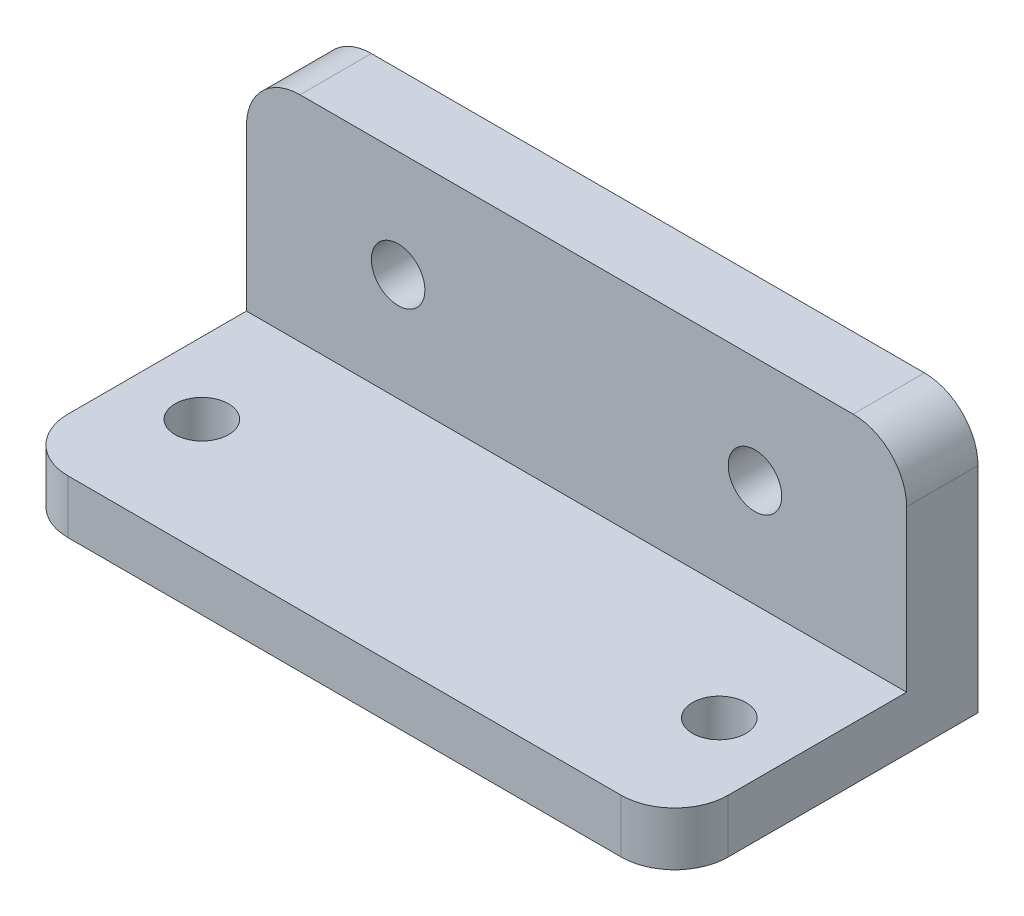
ISO-10303-21;
HEADER;
FILE_DESCRIPTION(('STEP AP214'),'2;1');
FILE_NAME('part.step','',(''),(''),'','','');
FILE_SCHEMA(('AUTOMOTIVE_DESIGN { 1 0 10303 214 1 1 1 1 }'));
ENDSEC;
DATA;
#1=APPLICATION_CONTEXT('core data for automotive mechanical design processes');
#2=APPLICATION_PROTOCOL_DEFINITION('international standard','automotive_design',2000,#1);
#3=PRODUCT_CONTEXT('',#1,'mechanical');
#4=PRODUCT('Part','Part','',(#3));
#5=PRODUCT_RELATED_PRODUCT_CATEGORY('part','',(#4));
#6=PRODUCT_DEFINITION_FORMATION('','',#4);
#7=PRODUCT_DEFINITION_CONTEXT('part definition',#1,'design');
#8=PRODUCT_DEFINITION('design','',#6,#7);
#9=PRODUCT_DEFINITION_SHAPE('','',#8);
#10=(LENGTH_UNIT() NAMED_UNIT(*) SI_UNIT(.MILLI.,.METRE.));
#11=(NAMED_UNIT(*) PLANE_ANGLE_UNIT() SI_UNIT($,.RADIAN.));
#12=(NAMED_UNIT(*) SI_UNIT($,.STERADIAN.) SOLID_ANGLE_UNIT());
#13=UNCERTAINTY_MEASURE_WITH_UNIT(LENGTH_MEASURE(1.E-05),#10,'distance_accuracy_value','');
#14=(GEOMETRIC_REPRESENTATION_CONTEXT(3) GLOBAL_UNCERTAINTY_ASSIGNED_CONTEXT((#13)) GLOBAL_UNIT_ASSIGNED_CONTEXT((#10,
#11,#12)) REPRESENTATION_CONTEXT('',''));
#15=CARTESIAN_POINT('',(0.,0.,0.));
#16=DIRECTION('',(0.,0.,1.));
#17=DIRECTION('',(1.,0.,0.));
#18=AXIS2_PLACEMENT_3D('',#15,#16,#17);
#19=CARTESIAN_POINT('',(-15.5,12.,0.));
#20=DIRECTION('',(0.,0.,-1.));
#21=DIRECTION('',(-1.,0.,0.));
#22=AXIS2_PLACEMENT_3D('',#19,#20,#21);
#23=CYLINDRICAL_SURFACE('',#22,3.);
#24=DIRECTION('',(0.,0.,1.));
#25=VECTOR('',#24,1.);
#26=CARTESIAN_POINT('',(-15.5,15.,0.));
#27=LINE('',#26,#25);
#28=CARTESIAN_POINT('',(-15.5,15.,-10.5));
#29=VERTEX_POINT('',#28);
#30=CARTESIAN_POINT('',(-15.5,15.,-6.50000000000001));
#31=VERTEX_POINT('',#30);
#32=EDGE_CURVE('E220',#29,#31,#27,.T.);
#33=ORIENTED_EDGE('',*,*,#32,.F.);
#34=CARTESIAN_POINT('',(-15.5,12.,-10.5));
#35=DIRECTION('',(0.,0.,-1.));
#36=DIRECTION('',(-1.,0.,0.));
#37=AXIS2_PLACEMENT_3D('',#34,#35,#36);
#38=CIRCLE('',#37,3.);
#39=CARTESIAN_POINT('',(-18.5,12.,-10.5));
#40=VERTEX_POINT('',#39);
#41=EDGE_CURVE('E226',#40,#29,#38,.T.);
#42=ORIENTED_EDGE('',*,*,#41,.F.);
#43=DIRECTION('',(0.,0.,1.));
#44=VECTOR('',#43,1.);
#45=CARTESIAN_POINT('',(-18.5,12.,0.));
#46=LINE('',#45,#44);
#47=CARTESIAN_POINT('',(-18.5,12.,-6.50000000000001));
#48=VERTEX_POINT('',#47);
#49=EDGE_CURVE('E141',#48,#40,#46,.F.);
#50=ORIENTED_EDGE('',*,*,#49,.F.);
#51=CARTESIAN_POINT('',(-15.5,12.,-6.50000000000001));
#52=DIRECTION('',(0.,0.,-1.));
#53=DIRECTION('',(-1.,0.,0.));
#54=AXIS2_PLACEMENT_3D('',#51,#52,#53);
#55=CIRCLE('',#54,3.);
#56=EDGE_CURVE('E229',#31,#48,#55,.F.);
#57=ORIENTED_EDGE('',*,*,#56,.F.);
#58=EDGE_LOOP('',(#33,#42,#50,#57));
#59=FACE_BOUND('',#58,.T.);
#60=ADVANCED_FACE('F45',(#59),#23,.T.);
#61=CARTESIAN_POINT('',(15.5,12.,6.5));
#62=DIRECTION('',(0.,0.,1.));
#63=DIRECTION('',(1.,0.,0.));
#64=AXIS2_PLACEMENT_3D('',#61,#62,#63);
#65=CYLINDRICAL_SURFACE('',#64,3.);
#66=DIRECTION('',(0.,0.,1.));
#67=VECTOR('',#66,1.);
#68=CARTESIAN_POINT('',(18.5,12.,6.5));
#69=LINE('',#68,#67);
#70=CARTESIAN_POINT('',(18.5000000000001,12.,-10.5));
#71=VERTEX_POINT('',#70);
#72=CARTESIAN_POINT('',(18.5,12.,-6.50000000000001));
#73=VERTEX_POINT('',#72);
#74=EDGE_CURVE('E200',#71,#73,#69,.T.);
#75=ORIENTED_EDGE('',*,*,#74,.F.);
#76=CARTESIAN_POINT('',(15.5,12.,-10.5));
#77=DIRECTION('',(0.,0.,-1.));
#78=DIRECTION('',(-1.,0.,0.));
#79=AXIS2_PLACEMENT_3D('',#76,#77,#78);
#80=CIRCLE('',#79,3.);
#81=CARTESIAN_POINT('',(15.5,15.,-10.5));
#82=VERTEX_POINT('',#81);
#83=EDGE_CURVE('E213',#82,#71,#80,.T.);
#84=ORIENTED_EDGE('',*,*,#83,.F.);
#85=DIRECTION('',(0.,0.,1.));
#86=VECTOR('',#85,1.);
#87=CARTESIAN_POINT('',(15.5,15.,0.));
#88=LINE('',#87,#86);
#89=CARTESIAN_POINT('',(15.5,15.,-6.50000000000001));
#90=VERTEX_POINT('',#89);
#91=EDGE_CURVE('E209',#90,#82,#88,.F.);
#92=ORIENTED_EDGE('',*,*,#91,.F.);
#93=CARTESIAN_POINT('',(15.5,12.,-6.50000000000001));
#94=DIRECTION('',(0.,0.,-1.));
#95=DIRECTION('',(-1.,0.,0.));
#96=AXIS2_PLACEMENT_3D('',#93,#94,#95);
#97=CIRCLE('',#96,3.);
#98=EDGE_CURVE('E216',#73,#90,#97,.F.);
#99=ORIENTED_EDGE('',*,*,#98,.F.);
#100=EDGE_LOOP('',(#75,#84,#92,#99));
#101=FACE_BOUND('',#100,.T.);
#102=ADVANCED_FACE('F280',(#101),#65,.T.);
#103=CARTESIAN_POINT('',(-18.5,3.,6.50000000000001));
#104=DIRECTION('',(-1.,0.,0.));
#105=DIRECTION('',(0.,0.,1.));
#106=AXIS2_PLACEMENT_3D('',#103,#104,#105);
#107=PLANE('',#106);
#108=DIRECTION('',(0.,0.,-1.));
#109=VECTOR('',#108,1.);
#110=CARTESIAN_POINT('',(-18.5,0.,6.50000000000001));
#111=LINE('',#110,#109);
#112=CARTESIAN_POINT('',(-18.5,0.,3.50000000000001));
#113=VERTEX_POINT('',#112);
#114=CARTESIAN_POINT('',(-18.5,0.,-10.5));
#115=VERTEX_POINT('',#114);
#116=EDGE_CURVE('E123',#113,#115,#111,.T.);
#117=ORIENTED_EDGE('',*,*,#116,.F.);
#118=DIRECTION('',(0.,-1.,0.));
#119=VECTOR('',#118,1.);
#120=CARTESIAN_POINT('',(-18.5,3.,3.50000000000001));
#121=LINE('',#120,#119);
#122=CARTESIAN_POINT('',(-18.5,3.,3.50000000000001));
#123=VERTEX_POINT('',#122);
#124=EDGE_CURVE('E11',#113,#123,#121,.F.);
#125=ORIENTED_EDGE('',*,*,#124,.T.);
#126=DIRECTION('',(0.,0.,-1.));
#127=VECTOR('',#126,1.);
#128=CARTESIAN_POINT('',(-18.5,3.,6.50000000000001));
#129=LINE('',#128,#127);
#130=CARTESIAN_POINT('',(-18.5,3.,-6.50000000000001));
#131=VERTEX_POINT('',#130);
#132=EDGE_CURVE('E187',#123,#131,#129,.T.);
#133=ORIENTED_EDGE('',*,*,#132,.T.);
#134=DIRECTION('',(0.,-1.,0.));
#135=VECTOR('',#134,1.);
#136=CARTESIAN_POINT('',(-18.5,15.,-6.50000000000001));
#137=LINE('',#136,#135);
#138=EDGE_CURVE('E162',#48,#131,#137,.T.);
#139=ORIENTED_EDGE('',*,*,#138,.F.);
#140=ORIENTED_EDGE('',*,*,#49,.T.);
#141=DIRECTION('',(0.,-1.,0.));
#142=VECTOR('',#141,1.);
#143=CARTESIAN_POINT('',(-18.5,15.,-10.5));
#144=LINE('',#143,#142);
#145=EDGE_CURVE('E137',#40,#115,#144,.T.);
#146=ORIENTED_EDGE('',*,*,#145,.T.);
#147=EDGE_LOOP('',(#117,#125,#133,#139,#140,#146));
#148=FACE_BOUND('',#147,.T.);
#149=ADVANCED_FACE('F138',(#148),#107,.T.);
#150=CARTESIAN_POINT('',(-18.5,3.,6.50000000000001));
#151=DIRECTION('',(0.,0.,-1.));
#152=DIRECTION('',(-1.,0.,0.));
#153=AXIS2_PLACEMENT_3D('',#150,#151,#152);
#154=PLANE('',#153);
#155=DIRECTION('',(1.,0.,0.));
#156=VECTOR('',#155,1.);
#157=CARTESIAN_POINT('',(-18.5,0.,6.50000000000001));
#158=LINE('',#157,#156);
#159=CARTESIAN_POINT('',(-15.5,0.,6.50000000000001));
#160=VERTEX_POINT('',#159);
#161=CARTESIAN_POINT('',(15.5,0.,6.5));
#162=VERTEX_POINT('',#161);
#163=EDGE_CURVE('E191',#160,#162,#158,.T.);
#164=ORIENTED_EDGE('',*,*,#163,.T.);
#165=DIRECTION('',(0.,-1.,0.));
#166=VECTOR('',#165,1.);
#167=CARTESIAN_POINT('',(15.5,3.,6.5));
#168=LINE('',#167,#166);
#169=CARTESIAN_POINT('',(15.5,3.,6.5));
#170=VERTEX_POINT('',#169);
#171=EDGE_CURVE('E67',#162,#170,#168,.F.);
#172=ORIENTED_EDGE('',*,*,#171,.T.);
#173=DIRECTION('',(1.,0.,0.));
#174=VECTOR('',#173,1.);
#175=CARTESIAN_POINT('',(-18.5,3.,6.50000000000001));
#176=LINE('',#175,#174);
#177=CARTESIAN_POINT('',(-15.5,3.,6.50000000000001));
#178=VERTEX_POINT('',#177);
#179=EDGE_CURVE('E198',#178,#170,#176,.T.);
#180=ORIENTED_EDGE('',*,*,#179,.F.);
#181=DIRECTION('',(0.,-1.,0.));
#182=VECTOR('',#181,1.);
#183=CARTESIAN_POINT('',(-15.5,0.,6.50000000000001));
#184=LINE('',#183,#182);
#185=EDGE_CURVE('E245',#178,#160,#184,.T.);
#186=ORIENTED_EDGE('',*,*,#185,.T.);
#187=EDGE_LOOP('',(#164,#172,#180,#186));
#188=FACE_BOUND('',#187,.T.);
#189=ADVANCED_FACE('F265',(#188),#154,.F.);
#190=CARTESIAN_POINT('',(18.5,3.,6.5));
#191=DIRECTION('',(-1.,0.,0.));
#192=DIRECTION('',(0.,0.,1.));
#193=AXIS2_PLACEMENT_3D('',#190,#191,#192);
#194=PLANE('',#193);
#195=DIRECTION('',(0.,0.,-1.));
#196=VECTOR('',#195,1.);
#197=CARTESIAN_POINT('',(18.5,3.,6.5));
#198=LINE('',#197,#196);
#199=CARTESIAN_POINT('',(18.5,3.,3.5));
#200=VERTEX_POINT('',#199);
#201=CARTESIAN_POINT('',(18.5,3.,-6.50000000000001));
#202=VERTEX_POINT('',#201);
#203=EDGE_CURVE('E195',#200,#202,#198,.T.);
#204=ORIENTED_EDGE('',*,*,#203,.F.);
#205=DIRECTION('',(0.,-1.,0.));
#206=VECTOR('',#205,1.);
#207=CARTESIAN_POINT('',(18.5,3.,3.5));
#208=LINE('',#207,#206);
#209=CARTESIAN_POINT('',(18.5,0.,3.5));
#210=VERTEX_POINT('',#209);
#211=EDGE_CURVE('E232',#200,#210,#208,.T.);
#212=ORIENTED_EDGE('',*,*,#211,.T.);
#213=DIRECTION('',(0.,0.,-1.));
#214=VECTOR('',#213,1.);
#215=CARTESIAN_POINT('',(18.5,0.,6.5));
#216=LINE('',#215,#214);
#217=CARTESIAN_POINT('',(18.5000000000001,0.,-10.5));
#218=VERTEX_POINT('',#217);
#219=EDGE_CURVE('E132',#210,#218,#216,.T.);
#220=ORIENTED_EDGE('',*,*,#219,.T.);
#221=DIRECTION('',(0.,-1.,0.));
#222=VECTOR('',#221,1.);
#223=CARTESIAN_POINT('',(18.5000000000001,15.,-10.5));
#224=LINE('',#223,#222);
#225=EDGE_CURVE('E144',#71,#218,#224,.T.);
#226=ORIENTED_EDGE('',*,*,#225,.F.);
#227=ORIENTED_EDGE('',*,*,#74,.T.);
#228=DIRECTION('',(0.,-1.,0.));
#229=VECTOR('',#228,1.);
#230=CARTESIAN_POINT('',(18.5,15.,-6.50000000000001));
#231=LINE('',#230,#229);
#232=EDGE_CURVE('E167',#73,#202,#231,.T.);
#233=ORIENTED_EDGE('',*,*,#232,.T.);
#234=EDGE_LOOP('',(#204,#212,#220,#226,#227,#233));
#235=FACE_BOUND('',#234,.T.);
#236=ADVANCED_FACE('F262',(#235),#194,.F.);
#237=CARTESIAN_POINT('',(0.,3.,0.));
#238=DIRECTION('',(0.,-1.,0.));
#239=DIRECTION('',(0.,0.,-1.));
#240=AXIS2_PLACEMENT_3D('',#237,#238,#239);
#241=PLANE('',#240);
#242=CARTESIAN_POINT('',(-14.5,3.,0.));
#243=DIRECTION('',(0.,-1.,0.));
#244=DIRECTION('',(0.,0.,-1.));
#245=AXIS2_PLACEMENT_3D('',#242,#243,#244);
#246=CIRCLE('',#245,1.5);
#247=CARTESIAN_POINT('',(-14.5,3.,-1.5));
#248=VERTEX_POINT('',#247);
#249=EDGE_CURVE('E133',#248,#248,#246,.T.);
#250=ORIENTED_EDGE('',*,*,#249,.T.);
#251=EDGE_LOOP('',(#250));
#252=FACE_BOUND('',#251,.T.);
#253=CARTESIAN_POINT('',(14.5,3.,0.));
#254=DIRECTION('',(0.,-1.,0.));
#255=DIRECTION('',(0.,0.,-1.));
#256=AXIS2_PLACEMENT_3D('',#253,#254,#255);
#257=CIRCLE('',#256,1.5);
#258=CARTESIAN_POINT('',(14.5,3.,-1.5));
#259=VERTEX_POINT('',#258);
#260=EDGE_CURVE('E166',#259,#259,#257,.T.);
#261=ORIENTED_EDGE('',*,*,#260,.T.);
#262=EDGE_LOOP('',(#261));
#263=FACE_BOUND('',#262,.T.);
#264=ORIENTED_EDGE('',*,*,#179,.T.);
#265=CARTESIAN_POINT('',(15.5,3.,3.5));
#266=DIRECTION('',(0.,-1.,0.));
#267=DIRECTION('',(0.,0.,-1.));
#268=AXIS2_PLACEMENT_3D('',#265,#266,#267);
#269=CIRCLE('',#268,3.);
#270=EDGE_CURVE('E54',#170,#200,#269,.F.);
#271=ORIENTED_EDGE('',*,*,#270,.T.);
#272=ORIENTED_EDGE('',*,*,#203,.T.);
#273=DIRECTION('',(1.,0.,0.));
#274=VECTOR('',#273,1.);
#275=CARTESIAN_POINT('',(-18.5,3.,-6.50000000000001));
#276=LINE('',#275,#274);
#277=EDGE_CURVE('E190',#131,#202,#276,.T.);
#278=ORIENTED_EDGE('',*,*,#277,.F.);
#279=ORIENTED_EDGE('',*,*,#132,.F.);
#280=CARTESIAN_POINT('',(-15.5,3.,3.50000000000001));
#281=DIRECTION('',(0.,-1.,0.));
#282=DIRECTION('',(0.,0.,-1.));
#283=AXIS2_PLACEMENT_3D('',#280,#281,#282);
#284=CIRCLE('',#283,3.);
#285=EDGE_CURVE('E251',#123,#178,#284,.F.);
#286=ORIENTED_EDGE('',*,*,#285,.T.);
#287=EDGE_LOOP('',(#264,#271,#272,#278,#279,#286));
#288=FACE_BOUND('',#287,.T.);
#289=ADVANCED_FACE('F257',(#252,#263,#288),#241,.F.);
#290=CARTESIAN_POINT('',(0.,0.,0.));
#291=DIRECTION('',(0.,-1.,0.));
#292=DIRECTION('',(0.,0.,-1.));
#293=AXIS2_PLACEMENT_3D('',#290,#291,#292);
#294=PLANE('',#293);
#295=CARTESIAN_POINT('',(-14.5,0.,0.));
#296=DIRECTION('',(0.,-1.,0.));
#297=DIRECTION('',(0.,0.,-1.));
#298=AXIS2_PLACEMENT_3D('',#295,#296,#297);
#299=CIRCLE('',#298,1.5);
#300=CARTESIAN_POINT('',(-14.5,0.,-1.5));
#301=VERTEX_POINT('',#300);
#302=EDGE_CURVE('E176',#301,#301,#299,.T.);
#303=ORIENTED_EDGE('',*,*,#302,.F.);
#304=EDGE_LOOP('',(#303));
#305=FACE_BOUND('',#304,.T.);
#306=CARTESIAN_POINT('',(14.5,0.,0.));
#307=DIRECTION('',(0.,-1.,0.));
#308=DIRECTION('',(0.,0.,-1.));
#309=AXIS2_PLACEMENT_3D('',#306,#307,#308);
#310=CIRCLE('',#309,1.5);
#311=CARTESIAN_POINT('',(14.5,0.,-1.5));
#312=VERTEX_POINT('',#311);
#313=EDGE_CURVE('E180',#312,#312,#310,.T.);
#314=ORIENTED_EDGE('',*,*,#313,.F.);
#315=EDGE_LOOP('',(#314));
#316=FACE_BOUND('',#315,.T.);
#317=ORIENTED_EDGE('',*,*,#219,.F.);
#318=CARTESIAN_POINT('',(15.5,0.,3.5));
#319=DIRECTION('',(0.,-1.,0.));
#320=DIRECTION('',(0.,0.,-1.));
#321=AXIS2_PLACEMENT_3D('',#318,#319,#320);
#322=CIRCLE('',#321,3.);
#323=EDGE_CURVE('E242',#210,#162,#322,.T.);
#324=ORIENTED_EDGE('',*,*,#323,.T.);
#325=ORIENTED_EDGE('',*,*,#163,.F.);
#326=CARTESIAN_POINT('',(-15.5,0.,3.50000000000001));
#327=DIRECTION('',(0.,-1.,0.));
#328=DIRECTION('',(0.,0.,-1.));
#329=AXIS2_PLACEMENT_3D('',#326,#327,#328);
#330=CIRCLE('',#329,3.);
#331=EDGE_CURVE('E130',#160,#113,#330,.T.);
#332=ORIENTED_EDGE('',*,*,#331,.T.);
#333=ORIENTED_EDGE('',*,*,#116,.T.);
#334=DIRECTION('',(1.,0.,0.));
#335=VECTOR('',#334,1.);
#336=CARTESIAN_POINT('',(-18.5,0.,-10.5));
#337=LINE('',#336,#335);
#338=EDGE_CURVE('E128',#115,#218,#337,.T.);
#339=ORIENTED_EDGE('',*,*,#338,.T.);
#340=EDGE_LOOP('',(#317,#324,#325,#332,#333,#339));
#341=FACE_BOUND('',#340,.T.);
#342=ADVANCED_FACE('F126',(#305,#316,#341),#294,.T.);
#343=CARTESIAN_POINT('',(14.5,3.,0.));
#344=DIRECTION('',(0.,-1.,0.));
#345=DIRECTION('',(0.,0.,-1.));
#346=AXIS2_PLACEMENT_3D('',#343,#344,#345);
#347=CYLINDRICAL_SURFACE('',#346,1.5);
#348=ORIENTED_EDGE('',*,*,#260,.F.);
#349=EDGE_LOOP('',(#348));
#350=FACE_BOUND('',#349,.T.);
#351=ORIENTED_EDGE('',*,*,#313,.T.);
#352=EDGE_LOOP('',(#351));
#353=FACE_BOUND('',#352,.T.);
#354=ADVANCED_FACE('F333',(#350,#353),#347,.F.);
#355=CARTESIAN_POINT('',(-14.5,3.,0.));
#356=DIRECTION('',(0.,-1.,0.));
#357=DIRECTION('',(0.,0.,-1.));
#358=AXIS2_PLACEMENT_3D('',#355,#356,#357);
#359=CYLINDRICAL_SURFACE('',#358,1.5);
#360=ORIENTED_EDGE('',*,*,#249,.F.);
#361=EDGE_LOOP('',(#360));
#362=FACE_BOUND('',#361,.T.);
#363=ORIENTED_EDGE('',*,*,#302,.T.);
#364=EDGE_LOOP('',(#363));
#365=FACE_BOUND('',#364,.T.);
#366=ADVANCED_FACE('F329',(#362,#365),#359,.F.);
#367=CARTESIAN_POINT('',(-18.5,15.,-6.50000000000001));
#368=DIRECTION('',(0.,0.,-1.));
#369=DIRECTION('',(-1.,0.,0.));
#370=AXIS2_PLACEMENT_3D('',#367,#368,#369);
#371=PLANE('',#370);
#372=CARTESIAN_POINT('',(-10.,9.01536156042064,-6.50000000000001));
#373=DIRECTION('',(0.,0.,1.));
#374=DIRECTION('',(-1.,0.,0.));
#375=AXIS2_PLACEMENT_3D('',#372,#373,#374);
#376=CIRCLE('',#375,1.5);
#377=CARTESIAN_POINT('',(-11.5,9.01536156042064,-6.50000000000001));
#378=VERTEX_POINT('',#377);
#379=EDGE_CURVE('E235',#378,#378,#376,.T.);
#380=ORIENTED_EDGE('',*,*,#379,.F.);
#381=EDGE_LOOP('',(#380));
#382=FACE_BOUND('',#381,.T.);
#383=CARTESIAN_POINT('',(10.,9.01536156042064,-6.50000000000001));
#384=DIRECTION('',(0.,0.,1.));
#385=DIRECTION('',(1.,0.,0.));
#386=AXIS2_PLACEMENT_3D('',#383,#384,#385);
#387=CIRCLE('',#386,1.5);
#388=CARTESIAN_POINT('',(11.5,9.01536156042064,-6.50000000000001));
#389=VERTEX_POINT('',#388);
#390=EDGE_CURVE('E321',#389,#389,#387,.T.);
#391=ORIENTED_EDGE('',*,*,#390,.F.);
#392=EDGE_LOOP('',(#391));
#393=FACE_BOUND('',#392,.T.);
#394=DIRECTION('',(1.,0.,0.));
#395=VECTOR('',#394,1.);
#396=CARTESIAN_POINT('',(-18.5,15.,-6.50000000000001));
#397=LINE('',#396,#395);
#398=EDGE_CURVE('E145',#31,#90,#397,.T.);
#399=ORIENTED_EDGE('',*,*,#398,.F.);
#400=ORIENTED_EDGE('',*,*,#56,.T.);
#401=ORIENTED_EDGE('',*,*,#138,.T.);
#402=ORIENTED_EDGE('',*,*,#277,.T.);
#403=ORIENTED_EDGE('',*,*,#232,.F.);
#404=ORIENTED_EDGE('',*,*,#98,.T.);
#405=EDGE_LOOP('',(#399,#400,#401,#402,#403,#404));
#406=FACE_BOUND('',#405,.T.);
#407=ADVANCED_FACE('F271',(#382,#393,#406),#371,.F.);
#408=CARTESIAN_POINT('',(-18.5,15.,-10.5));
#409=DIRECTION('',(0.,0.,-1.));
#410=DIRECTION('',(-1.,0.,0.));
#411=AXIS2_PLACEMENT_3D('',#408,#409,#410);
#412=PLANE('',#411);
#413=CARTESIAN_POINT('',(-10.,9.01536156042064,-10.5));
#414=DIRECTION('',(0.,0.,-1.));
#415=DIRECTION('',(-1.,0.,0.));
#416=AXIS2_PLACEMENT_3D('',#413,#414,#415);
#417=CIRCLE('',#416,1.5);
#418=CARTESIAN_POINT('',(-11.5,9.01536156042064,-10.5));
#419=VERTEX_POINT('',#418);
#420=EDGE_CURVE('E152',#419,#419,#417,.T.);
#421=ORIENTED_EDGE('',*,*,#420,.F.);
#422=EDGE_LOOP('',(#421));
#423=FACE_BOUND('',#422,.T.);
#424=CARTESIAN_POINT('',(10.,9.01536156042064,-10.5));
#425=DIRECTION('',(0.,0.,-1.));
#426=DIRECTION('',(-1.,0.,0.));
#427=AXIS2_PLACEMENT_3D('',#424,#425,#426);
#428=CIRCLE('',#427,1.5);
#429=CARTESIAN_POINT('',(8.5,9.01536156042064,-10.5));
#430=VERTEX_POINT('',#429);
#431=EDGE_CURVE('E158',#430,#430,#428,.T.);
#432=ORIENTED_EDGE('',*,*,#431,.F.);
#433=EDGE_LOOP('',(#432));
#434=FACE_BOUND('',#433,.T.);
#435=ORIENTED_EDGE('',*,*,#145,.F.);
#436=ORIENTED_EDGE('',*,*,#41,.T.);
#437=DIRECTION('',(1.,0.,0.));
#438=VECTOR('',#437,1.);
#439=CARTESIAN_POINT('',(-18.5,15.,-10.5));
#440=LINE('',#439,#438);
#441=EDGE_CURVE('E151',#29,#82,#440,.T.);
#442=ORIENTED_EDGE('',*,*,#441,.T.);
#443=ORIENTED_EDGE('',*,*,#83,.T.);
#444=ORIENTED_EDGE('',*,*,#225,.T.);
#445=ORIENTED_EDGE('',*,*,#338,.F.);
#446=EDGE_LOOP('',(#435,#436,#442,#443,#444,#445));
#447=FACE_BOUND('',#446,.T.);
#448=ADVANCED_FACE('F148',(#423,#434,#447),#412,.T.);
#449=CARTESIAN_POINT('',(0.,15.,0.));
#450=DIRECTION('',(0.,-1.,0.));
#451=DIRECTION('',(0.,0.,-1.));
#452=AXIS2_PLACEMENT_3D('',#449,#450,#451);
#453=PLANE('',#452);
#454=ORIENTED_EDGE('',*,*,#441,.F.);
#455=ORIENTED_EDGE('',*,*,#32,.T.);
#456=ORIENTED_EDGE('',*,*,#398,.T.);
#457=ORIENTED_EDGE('',*,*,#91,.T.);
#458=EDGE_LOOP('',(#454,#455,#456,#457));
#459=FACE_BOUND('',#458,.T.);
#460=ADVANCED_FACE('F281',(#459),#453,.F.);
#461=CARTESIAN_POINT('',(10.,9.01536156042064,-16.5));
#462=DIRECTION('',(0.,0.,1.));
#463=DIRECTION('',(1.,0.,0.));
#464=AXIS2_PLACEMENT_3D('',#461,#462,#463);
#465=CYLINDRICAL_SURFACE('',#464,1.5);
#466=ORIENTED_EDGE('',*,*,#431,.T.);
#467=EDGE_LOOP('',(#466));
#468=FACE_BOUND('',#467,.T.);
#469=ORIENTED_EDGE('',*,*,#390,.T.);
#470=EDGE_LOOP('',(#469));
#471=FACE_BOUND('',#470,.T.);
#472=ADVANCED_FACE('F284',(#468,#471),#465,.F.);
#473=CARTESIAN_POINT('',(-10.,9.01536156042064,-16.5));
#474=DIRECTION('',(0.,0.,1.));
#475=DIRECTION('',(1.,0.,0.));
#476=AXIS2_PLACEMENT_3D('',#473,#474,#475);
#477=CYLINDRICAL_SURFACE('',#476,1.5);
#478=ORIENTED_EDGE('',*,*,#420,.T.);
#479=EDGE_LOOP('',(#478));
#480=FACE_BOUND('',#479,.T.);
#481=ORIENTED_EDGE('',*,*,#379,.T.);
#482=EDGE_LOOP('',(#481));
#483=FACE_BOUND('',#482,.T.);
#484=ADVANCED_FACE('F291',(#480,#483),#477,.F.);
#485=CARTESIAN_POINT('',(15.5,3.,3.5));
#486=DIRECTION('',(0.,-1.,0.));
#487=DIRECTION('',(0.,0.,-1.));
#488=AXIS2_PLACEMENT_3D('',#485,#486,#487);
#489=CYLINDRICAL_SURFACE('',#488,3.);
#490=ORIENTED_EDGE('',*,*,#270,.F.);
#491=ORIENTED_EDGE('',*,*,#171,.F.);
#492=ORIENTED_EDGE('',*,*,#323,.F.);
#493=ORIENTED_EDGE('',*,*,#211,.F.);
#494=EDGE_LOOP('',(#490,#491,#492,#493));
#495=FACE_BOUND('',#494,.T.);
#496=ADVANCED_FACE('F264',(#495),#489,.T.);
#497=CARTESIAN_POINT('',(-15.5,3.,3.50000000000001));
#498=DIRECTION('',(0.,1.,0.));
#499=DIRECTION('',(0.,0.,1.));
#500=AXIS2_PLACEMENT_3D('',#497,#498,#499);
#501=CYLINDRICAL_SURFACE('',#500,3.);
#502=ORIENTED_EDGE('',*,*,#285,.F.);
#503=ORIENTED_EDGE('',*,*,#124,.F.);
#504=ORIENTED_EDGE('',*,*,#331,.F.);
#505=ORIENTED_EDGE('',*,*,#185,.F.);
#506=EDGE_LOOP('',(#502,#503,#504,#505));
#507=FACE_BOUND('',#506,.T.);
#508=ADVANCED_FACE('F47',(#507),#501,.T.);
#509=CLOSED_SHELL('',(#60,#102,#149,#189,#236,#289,#342,#354,#366,#407,#448,#460,#472,#484,#496,#508));
#510=MANIFOLD_SOLID_BREP('B2',#509);
#511=ADVANCED_BREP_SHAPE_REPRESENTATION('',(#18,#510),#14);
#512=SHAPE_DEFINITION_REPRESENTATION(#9,#511);
ENDSEC;
END-ISO-10303-21;
